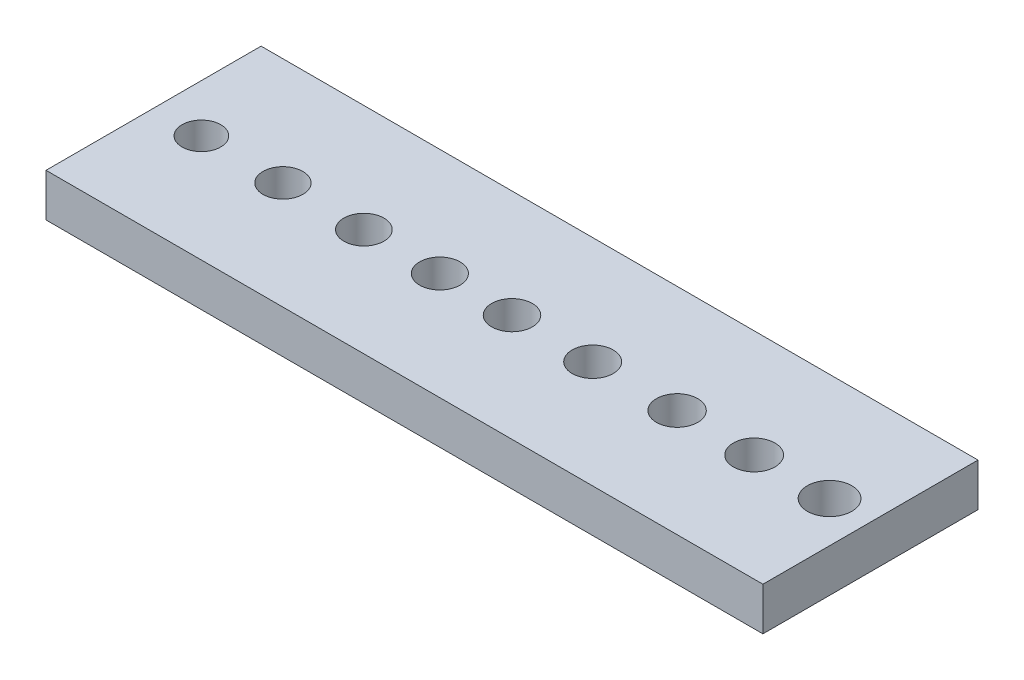
ISO-10303-21;
HEADER;
FILE_DESCRIPTION(('STEP AP214'),'2;1');
FILE_NAME('part.step','',(''),(''),'','','');
FILE_SCHEMA(('AUTOMOTIVE_DESIGN { 1 0 10303 214 1 1 1 1 }'));
ENDSEC;
DATA;
#1=APPLICATION_CONTEXT('core data for automotive mechanical design processes');
#2=APPLICATION_PROTOCOL_DEFINITION('international standard','automotive_design',2000,#1);
#3=PRODUCT_CONTEXT('',#1,'mechanical');
#4=PRODUCT('Part','Part','',(#3));
#5=PRODUCT_RELATED_PRODUCT_CATEGORY('part','',(#4));
#6=PRODUCT_DEFINITION_FORMATION('','',#4);
#7=PRODUCT_DEFINITION_CONTEXT('part definition',#1,'design');
#8=PRODUCT_DEFINITION('design','',#6,#7);
#9=PRODUCT_DEFINITION_SHAPE('','',#8);
#10=(LENGTH_UNIT() NAMED_UNIT(*) SI_UNIT(.MILLI.,.METRE.));
#11=(NAMED_UNIT(*) PLANE_ANGLE_UNIT() SI_UNIT($,.RADIAN.));
#12=(NAMED_UNIT(*) SI_UNIT($,.STERADIAN.) SOLID_ANGLE_UNIT());
#13=UNCERTAINTY_MEASURE_WITH_UNIT(LENGTH_MEASURE(1.E-05),#10,'distance_accuracy_value','');
#14=(GEOMETRIC_REPRESENTATION_CONTEXT(3) GLOBAL_UNCERTAINTY_ASSIGNED_CONTEXT((#13)) GLOBAL_UNIT_ASSIGNED_CONTEXT((#10,
#11,#12)) REPRESENTATION_CONTEXT('',''));
#15=CARTESIAN_POINT('',(0.,0.,0.));
#16=DIRECTION('',(0.,0.,1.));
#17=DIRECTION('',(1.,0.,0.));
#18=AXIS2_PLACEMENT_3D('',#15,#16,#17);
#19=CARTESIAN_POINT('',(0.,3.,0.));
#20=DIRECTION('',(0.,-1.,0.));
#21=DIRECTION('',(0.,0.,-1.));
#22=AXIS2_PLACEMENT_3D('',#19,#20,#21);
#23=PLANE('',#22);
#24=CARTESIAN_POINT('',(22.1489276135597,3.,0.));
#25=DIRECTION('',(0.,1.,0.));
#26=DIRECTION('',(0.,0.,1.));
#27=AXIS2_PLACEMENT_3D('',#24,#25,#26);
#28=CIRCLE('',#27,1.55);
#29=CARTESIAN_POINT('',(22.1489276135597,3.,1.55));
#30=VERTEX_POINT('',#29);
#31=EDGE_CURVE('E167',#30,#30,#28,.T.);
#32=ORIENTED_EDGE('',*,*,#31,.F.);
#33=EDGE_LOOP('',(#32));
#34=FACE_BOUND('',#33,.T.);
#35=DIRECTION('',(0.,0.,-1.));
#36=VECTOR('',#35,1.);
#37=CARTESIAN_POINT('',(25.,3.,7.50000000000001));
#38=LINE('',#37,#36);
#39=CARTESIAN_POINT('',(25.,3.,7.50000000000001));
#40=VERTEX_POINT('',#39);
#41=CARTESIAN_POINT('',(25.,3.,-7.49999999999999));
#42=VERTEX_POINT('',#41);
#43=EDGE_CURVE('E92',#40,#42,#38,.T.);
#44=ORIENTED_EDGE('',*,*,#43,.T.);
#45=DIRECTION('',(-1.,0.,0.));
#46=VECTOR('',#45,1.);
#47=CARTESIAN_POINT('',(-25.,3.,-7.50000000000001));
#48=LINE('',#47,#46);
#49=CARTESIAN_POINT('',(-25.,3.,-7.50000000000001));
#50=VERTEX_POINT('',#49);
#51=EDGE_CURVE('E87',#42,#50,#48,.T.);
#52=ORIENTED_EDGE('',*,*,#51,.T.);
#53=DIRECTION('',(0.,0.,1.));
#54=VECTOR('',#53,1.);
#55=CARTESIAN_POINT('',(-25.,3.,7.50000000000001));
#56=LINE('',#55,#54);
#57=CARTESIAN_POINT('',(-25.,3.,7.50000000000001));
#58=VERTEX_POINT('',#57);
#59=EDGE_CURVE('E90',#50,#58,#56,.T.);
#60=ORIENTED_EDGE('',*,*,#59,.T.);
#61=DIRECTION('',(1.,0.,0.));
#62=VECTOR('',#61,1.);
#63=CARTESIAN_POINT('',(-25.,3.,7.50000000000001));
#64=LINE('',#63,#62);
#65=EDGE_CURVE('E57',#58,#40,#64,.T.);
#66=ORIENTED_EDGE('',*,*,#65,.T.);
#67=EDGE_LOOP('',(#44,#52,#60,#66));
#68=FACE_BOUND('',#67,.T.);
#69=CARTESIAN_POINT('',(-21.6626681984285,3.,0.));
#70=DIRECTION('',(0.,1.,0.));
#71=DIRECTION('',(0.,0.,1.));
#72=AXIS2_PLACEMENT_3D('',#69,#70,#71);
#73=CIRCLE('',#72,1.35);
#74=CARTESIAN_POINT('',(-21.6626681984285,3.,1.35));
#75=VERTEX_POINT('',#74);
#76=EDGE_CURVE('E108',#75,#75,#73,.T.);
#77=ORIENTED_EDGE('',*,*,#76,.F.);
#78=EDGE_LOOP('',(#77));
#79=FACE_BOUND('',#78,.T.);
#80=CARTESIAN_POINT('',(-15.9774005820567,3.,0.));
#81=DIRECTION('',(0.,1.,0.));
#82=DIRECTION('',(0.,0.,1.));
#83=AXIS2_PLACEMENT_3D('',#80,#81,#82);
#84=CIRCLE('',#83,1.39);
#85=CARTESIAN_POINT('',(-15.9774005820567,3.,1.39));
#86=VERTEX_POINT('',#85);
#87=EDGE_CURVE('E123',#86,#86,#84,.T.);
#88=ORIENTED_EDGE('',*,*,#87,.F.);
#89=EDGE_LOOP('',(#88));
#90=FACE_BOUND('',#89,.T.);
#91=CARTESIAN_POINT('',(-10.3308082555922,3.,0.));
#92=DIRECTION('',(0.,1.,0.));
#93=DIRECTION('',(0.,0.,1.));
#94=AXIS2_PLACEMENT_3D('',#91,#92,#93);
#95=CIRCLE('',#94,1.4);
#96=CARTESIAN_POINT('',(-10.3308082555922,3.,1.4));
#97=VERTEX_POINT('',#96);
#98=EDGE_CURVE('E129',#97,#97,#95,.T.);
#99=ORIENTED_EDGE('',*,*,#98,.F.);
#100=EDGE_LOOP('',(#99));
#101=FACE_BOUND('',#100,.T.);
#102=CARTESIAN_POINT('',(-5.03229353829333,3.,0.));
#103=DIRECTION('',(0.,1.,0.));
#104=DIRECTION('',(0.,0.,1.));
#105=AXIS2_PLACEMENT_3D('',#102,#103,#104);
#106=CIRCLE('',#105,1.41);
#107=CARTESIAN_POINT('',(-5.03229353829333,3.,1.41));
#108=VERTEX_POINT('',#107);
#109=EDGE_CURVE('E135',#108,#108,#106,.T.);
#110=ORIENTED_EDGE('',*,*,#109,.F.);
#111=EDGE_LOOP('',(#110));
#112=FACE_BOUND('',#111,.T.);
#113=CARTESIAN_POINT('',(0.,3.,0.));
#114=DIRECTION('',(0.,1.,0.));
#115=DIRECTION('',(0.,0.,1.));
#116=AXIS2_PLACEMENT_3D('',#113,#114,#115);
#117=CIRCLE('',#116,1.42);
#118=CARTESIAN_POINT('',(0.,3.,1.42));
#119=VERTEX_POINT('',#118);
#120=EDGE_CURVE('E141',#119,#119,#117,.T.);
#121=ORIENTED_EDGE('',*,*,#120,.F.);
#122=EDGE_LOOP('',(#121));
#123=FACE_BOUND('',#122,.T.);
#124=CARTESIAN_POINT('',(5.62658879630789,3.,0.));
#125=DIRECTION('',(0.,1.,0.));
#126=DIRECTION('',(0.,0.,1.));
#127=AXIS2_PLACEMENT_3D('',#124,#125,#126);
#128=CIRCLE('',#127,1.43);
#129=CARTESIAN_POINT('',(5.62658879630789,3.,1.43));
#130=VERTEX_POINT('',#129);
#131=EDGE_CURVE('E147',#130,#130,#128,.T.);
#132=ORIENTED_EDGE('',*,*,#131,.F.);
#133=EDGE_LOOP('',(#132));
#134=FACE_BOUND('',#133,.T.);
#135=CARTESIAN_POINT('',(11.5163956606518,3.,0.));
#136=DIRECTION('',(0.,1.,0.));
#137=DIRECTION('',(0.,0.,1.));
#138=AXIS2_PLACEMENT_3D('',#135,#136,#137);
#139=CIRCLE('',#138,1.44);
#140=CARTESIAN_POINT('',(11.5163956606518,3.,1.44));
#141=VERTEX_POINT('',#140);
#142=EDGE_CURVE('E153',#141,#141,#139,.T.);
#143=ORIENTED_EDGE('',*,*,#142,.F.);
#144=EDGE_LOOP('',(#143));
#145=FACE_BOUND('',#144,.T.);
#146=CARTESIAN_POINT('',(16.8874494202306,3.,0.));
#147=DIRECTION('',(0.,1.,0.));
#148=DIRECTION('',(0.,0.,1.));
#149=AXIS2_PLACEMENT_3D('',#146,#147,#148);
#150=CIRCLE('',#149,1.45);
#151=CARTESIAN_POINT('',(16.8874494202306,3.,1.45));
#152=VERTEX_POINT('',#151);
#153=EDGE_CURVE('E159',#152,#152,#150,.T.);
#154=ORIENTED_EDGE('',*,*,#153,.F.);
#155=EDGE_LOOP('',(#154));
#156=FACE_BOUND('',#155,.T.);
#157=ADVANCED_FACE('F39',(#34,#68,#79,#90,#101,#112,#123,#134,#145,#156),#23,.F.);
#158=CARTESIAN_POINT('',(0.,0.,0.));
#159=DIRECTION('',(0.,-1.,0.));
#160=DIRECTION('',(0.,0.,-1.));
#161=AXIS2_PLACEMENT_3D('',#158,#159,#160);
#162=PLANE('',#161);
#163=CARTESIAN_POINT('',(22.1489276135597,0.,0.));
#164=DIRECTION('',(0.,-1.,0.));
#165=DIRECTION('',(0.,0.,-1.));
#166=AXIS2_PLACEMENT_3D('',#163,#164,#165);
#167=CIRCLE('',#166,1.55);
#168=CARTESIAN_POINT('',(22.1489276135597,0.,-1.55));
#169=VERTEX_POINT('',#168);
#170=EDGE_CURVE('E43',#169,#169,#167,.T.);
#171=ORIENTED_EDGE('',*,*,#170,.F.);
#172=EDGE_LOOP('',(#171));
#173=FACE_BOUND('',#172,.T.);
#174=CARTESIAN_POINT('',(11.5163956606518,0.,0.));
#175=DIRECTION('',(0.,1.,0.));
#176=DIRECTION('',(0.,0.,1.));
#177=AXIS2_PLACEMENT_3D('',#174,#175,#176);
#178=CIRCLE('',#177,1.44);
#179=CARTESIAN_POINT('',(11.5163956606518,0.,1.44));
#180=VERTEX_POINT('',#179);
#181=EDGE_CURVE('E156',#180,#180,#178,.T.);
#182=ORIENTED_EDGE('',*,*,#181,.T.);
#183=EDGE_LOOP('',(#182));
#184=FACE_BOUND('',#183,.T.);
#185=CARTESIAN_POINT('',(0.,0.,0.));
#186=DIRECTION('',(0.,1.,0.));
#187=DIRECTION('',(0.,0.,1.));
#188=AXIS2_PLACEMENT_3D('',#185,#186,#187);
#189=CIRCLE('',#188,1.42);
#190=CARTESIAN_POINT('',(0.,0.,1.42));
#191=VERTEX_POINT('',#190);
#192=EDGE_CURVE('E144',#191,#191,#189,.T.);
#193=ORIENTED_EDGE('',*,*,#192,.T.);
#194=EDGE_LOOP('',(#193));
#195=FACE_BOUND('',#194,.T.);
#196=CARTESIAN_POINT('',(-10.3308082555922,0.,0.));
#197=DIRECTION('',(0.,1.,0.));
#198=DIRECTION('',(0.,0.,1.));
#199=AXIS2_PLACEMENT_3D('',#196,#197,#198);
#200=CIRCLE('',#199,1.4);
#201=CARTESIAN_POINT('',(-10.3308082555922,0.,1.4));
#202=VERTEX_POINT('',#201);
#203=EDGE_CURVE('E132',#202,#202,#200,.T.);
#204=ORIENTED_EDGE('',*,*,#203,.T.);
#205=EDGE_LOOP('',(#204));
#206=FACE_BOUND('',#205,.T.);
#207=CARTESIAN_POINT('',(-21.6626681984285,0.,0.));
#208=DIRECTION('',(0.,1.,0.));
#209=DIRECTION('',(0.,0.,1.));
#210=AXIS2_PLACEMENT_3D('',#207,#208,#209);
#211=CIRCLE('',#210,1.35);
#212=CARTESIAN_POINT('',(-21.6626681984285,0.,1.35));
#213=VERTEX_POINT('',#212);
#214=EDGE_CURVE('E120',#213,#213,#211,.T.);
#215=ORIENTED_EDGE('',*,*,#214,.T.);
#216=EDGE_LOOP('',(#215));
#217=FACE_BOUND('',#216,.T.);
#218=DIRECTION('',(0.,0.,-1.));
#219=VECTOR('',#218,1.);
#220=CARTESIAN_POINT('',(25.,0.,7.50000000000001));
#221=LINE('',#220,#219);
#222=CARTESIAN_POINT('',(25.,0.,7.50000000000001));
#223=VERTEX_POINT('',#222);
#224=CARTESIAN_POINT('',(25.,0.,-7.49999999999999));
#225=VERTEX_POINT('',#224);
#226=EDGE_CURVE('E105',#223,#225,#221,.T.);
#227=ORIENTED_EDGE('',*,*,#226,.F.);
#228=DIRECTION('',(1.,0.,0.));
#229=VECTOR('',#228,1.);
#230=CARTESIAN_POINT('',(-25.,0.,7.50000000000001));
#231=LINE('',#230,#229);
#232=CARTESIAN_POINT('',(-25.,0.,7.50000000000001));
#233=VERTEX_POINT('',#232);
#234=EDGE_CURVE('E80',#233,#223,#231,.T.);
#235=ORIENTED_EDGE('',*,*,#234,.F.);
#236=DIRECTION('',(0.,0.,1.));
#237=VECTOR('',#236,1.);
#238=CARTESIAN_POINT('',(-25.,0.,7.50000000000001));
#239=LINE('',#238,#237);
#240=CARTESIAN_POINT('',(-25.,0.,-7.50000000000001));
#241=VERTEX_POINT('',#240);
#242=EDGE_CURVE('E74',#241,#233,#239,.T.);
#243=ORIENTED_EDGE('',*,*,#242,.F.);
#244=DIRECTION('',(-1.,0.,0.));
#245=VECTOR('',#244,1.);
#246=CARTESIAN_POINT('',(-25.,0.,-7.50000000000001));
#247=LINE('',#246,#245);
#248=EDGE_CURVE('E96',#225,#241,#247,.T.);
#249=ORIENTED_EDGE('',*,*,#248,.F.);
#250=EDGE_LOOP('',(#227,#235,#243,#249));
#251=FACE_BOUND('',#250,.T.);
#252=CARTESIAN_POINT('',(-15.9774005820567,0.,0.));
#253=DIRECTION('',(0.,1.,0.));
#254=DIRECTION('',(0.,0.,1.));
#255=AXIS2_PLACEMENT_3D('',#252,#253,#254);
#256=CIRCLE('',#255,1.39);
#257=CARTESIAN_POINT('',(-15.9774005820567,0.,1.39));
#258=VERTEX_POINT('',#257);
#259=EDGE_CURVE('E126',#258,#258,#256,.T.);
#260=ORIENTED_EDGE('',*,*,#259,.T.);
#261=EDGE_LOOP('',(#260));
#262=FACE_BOUND('',#261,.T.);
#263=CARTESIAN_POINT('',(-5.03229353829333,0.,0.));
#264=DIRECTION('',(0.,1.,0.));
#265=DIRECTION('',(0.,0.,1.));
#266=AXIS2_PLACEMENT_3D('',#263,#264,#265);
#267=CIRCLE('',#266,1.41);
#268=CARTESIAN_POINT('',(-5.03229353829333,0.,1.41));
#269=VERTEX_POINT('',#268);
#270=EDGE_CURVE('E138',#269,#269,#267,.T.);
#271=ORIENTED_EDGE('',*,*,#270,.T.);
#272=EDGE_LOOP('',(#271));
#273=FACE_BOUND('',#272,.T.);
#274=CARTESIAN_POINT('',(5.62658879630789,0.,0.));
#275=DIRECTION('',(0.,1.,0.));
#276=DIRECTION('',(0.,0.,1.));
#277=AXIS2_PLACEMENT_3D('',#274,#275,#276);
#278=CIRCLE('',#277,1.43);
#279=CARTESIAN_POINT('',(5.62658879630789,0.,1.43));
#280=VERTEX_POINT('',#279);
#281=EDGE_CURVE('E150',#280,#280,#278,.T.);
#282=ORIENTED_EDGE('',*,*,#281,.T.);
#283=EDGE_LOOP('',(#282));
#284=FACE_BOUND('',#283,.T.);
#285=CARTESIAN_POINT('',(16.8874494202306,0.,0.));
#286=DIRECTION('',(0.,1.,0.));
#287=DIRECTION('',(0.,0.,1.));
#288=AXIS2_PLACEMENT_3D('',#285,#286,#287);
#289=CIRCLE('',#288,1.45);
#290=CARTESIAN_POINT('',(16.8874494202306,0.,1.45));
#291=VERTEX_POINT('',#290);
#292=EDGE_CURVE('E162',#291,#291,#289,.T.);
#293=ORIENTED_EDGE('',*,*,#292,.T.);
#294=EDGE_LOOP('',(#293));
#295=FACE_BOUND('',#294,.T.);
#296=ADVANCED_FACE('F116',(#173,#184,#195,#206,#217,#251,#262,#273,#284,#295),#162,.T.);
#297=CARTESIAN_POINT('',(25.,3.,7.50000000000001));
#298=DIRECTION('',(-1.,0.,0.));
#299=DIRECTION('',(0.,0.,1.));
#300=AXIS2_PLACEMENT_3D('',#297,#298,#299);
#301=PLANE('',#300);
#302=ORIENTED_EDGE('',*,*,#226,.T.);
#303=DIRECTION('',(0.,-1.,0.));
#304=VECTOR('',#303,1.);
#305=CARTESIAN_POINT('',(25.,3.,-7.49999999999999));
#306=LINE('',#305,#304);
#307=EDGE_CURVE('E11',#42,#225,#306,.T.);
#308=ORIENTED_EDGE('',*,*,#307,.F.);
#309=ORIENTED_EDGE('',*,*,#43,.F.);
#310=DIRECTION('',(0.,-1.,0.));
#311=VECTOR('',#310,1.);
#312=CARTESIAN_POINT('',(25.,3.,7.50000000000001));
#313=LINE('',#312,#311);
#314=EDGE_CURVE('E101',#40,#223,#313,.T.);
#315=ORIENTED_EDGE('',*,*,#314,.T.);
#316=EDGE_LOOP('',(#302,#308,#309,#315));
#317=FACE_BOUND('',#316,.T.);
#318=ADVANCED_FACE('F41',(#317),#301,.F.);
#319=CARTESIAN_POINT('',(-25.,3.,-7.50000000000001));
#320=DIRECTION('',(0.,0.,1.));
#321=DIRECTION('',(1.,0.,0.));
#322=AXIS2_PLACEMENT_3D('',#319,#320,#321);
#323=PLANE('',#322);
#324=ORIENTED_EDGE('',*,*,#248,.T.);
#325=DIRECTION('',(0.,-1.,0.));
#326=VECTOR('',#325,1.);
#327=CARTESIAN_POINT('',(-25.,3.,-7.50000000000001));
#328=LINE('',#327,#326);
#329=EDGE_CURVE('E49',#50,#241,#328,.T.);
#330=ORIENTED_EDGE('',*,*,#329,.F.);
#331=ORIENTED_EDGE('',*,*,#51,.F.);
#332=ORIENTED_EDGE('',*,*,#307,.T.);
#333=EDGE_LOOP('',(#324,#330,#331,#332));
#334=FACE_BOUND('',#333,.T.);
#335=ADVANCED_FACE('F95',(#334),#323,.F.);
#336=CARTESIAN_POINT('',(-25.,3.,7.50000000000001));
#337=DIRECTION('',(1.,0.,0.));
#338=DIRECTION('',(0.,0.,-1.));
#339=AXIS2_PLACEMENT_3D('',#336,#337,#338);
#340=PLANE('',#339);
#341=ORIENTED_EDGE('',*,*,#242,.T.);
#342=DIRECTION('',(0.,-1.,0.));
#343=VECTOR('',#342,1.);
#344=CARTESIAN_POINT('',(-25.,3.,7.50000000000001));
#345=LINE('',#344,#343);
#346=EDGE_CURVE('E97',#58,#233,#345,.T.);
#347=ORIENTED_EDGE('',*,*,#346,.F.);
#348=ORIENTED_EDGE('',*,*,#59,.F.);
#349=ORIENTED_EDGE('',*,*,#329,.T.);
#350=EDGE_LOOP('',(#341,#347,#348,#349));
#351=FACE_BOUND('',#350,.T.);
#352=ADVANCED_FACE('F99',(#351),#340,.F.);
#353=CARTESIAN_POINT('',(-25.,3.,7.50000000000001));
#354=DIRECTION('',(0.,0.,-1.));
#355=DIRECTION('',(-1.,0.,0.));
#356=AXIS2_PLACEMENT_3D('',#353,#354,#355);
#357=PLANE('',#356);
#358=ORIENTED_EDGE('',*,*,#234,.T.);
#359=ORIENTED_EDGE('',*,*,#314,.F.);
#360=ORIENTED_EDGE('',*,*,#65,.F.);
#361=ORIENTED_EDGE('',*,*,#346,.T.);
#362=EDGE_LOOP('',(#358,#359,#360,#361));
#363=FACE_BOUND('',#362,.T.);
#364=ADVANCED_FACE('F113',(#363),#357,.F.);
#365=CARTESIAN_POINT('',(-21.6626681984285,3.,0.));
#366=DIRECTION('',(0.,-1.,0.));
#367=DIRECTION('',(0.,0.,-1.));
#368=AXIS2_PLACEMENT_3D('',#365,#366,#367);
#369=CYLINDRICAL_SURFACE('',#368,1.35);
#370=ORIENTED_EDGE('',*,*,#76,.T.);
#371=EDGE_LOOP('',(#370));
#372=FACE_BOUND('',#371,.T.);
#373=ORIENTED_EDGE('',*,*,#214,.F.);
#374=EDGE_LOOP('',(#373));
#375=FACE_BOUND('',#374,.T.);
#376=ADVANCED_FACE('F187',(#372,#375),#369,.F.);
#377=CARTESIAN_POINT('',(-15.9774005820567,3.,0.));
#378=DIRECTION('',(0.,-1.,0.));
#379=DIRECTION('',(0.,0.,-1.));
#380=AXIS2_PLACEMENT_3D('',#377,#378,#379);
#381=CYLINDRICAL_SURFACE('',#380,1.39);
#382=ORIENTED_EDGE('',*,*,#87,.T.);
#383=EDGE_LOOP('',(#382));
#384=FACE_BOUND('',#383,.T.);
#385=ORIENTED_EDGE('',*,*,#259,.F.);
#386=EDGE_LOOP('',(#385));
#387=FACE_BOUND('',#386,.T.);
#388=ADVANCED_FACE('F189',(#384,#387),#381,.F.);
#389=CARTESIAN_POINT('',(-10.3308082555922,3.,0.));
#390=DIRECTION('',(0.,-1.,0.));
#391=DIRECTION('',(0.,0.,-1.));
#392=AXIS2_PLACEMENT_3D('',#389,#390,#391);
#393=CYLINDRICAL_SURFACE('',#392,1.4);
#394=ORIENTED_EDGE('',*,*,#98,.T.);
#395=EDGE_LOOP('',(#394));
#396=FACE_BOUND('',#395,.T.);
#397=ORIENTED_EDGE('',*,*,#203,.F.);
#398=EDGE_LOOP('',(#397));
#399=FACE_BOUND('',#398,.T.);
#400=ADVANCED_FACE('F196',(#396,#399),#393,.F.);
#401=CARTESIAN_POINT('',(-5.03229353829333,3.,0.));
#402=DIRECTION('',(0.,-1.,0.));
#403=DIRECTION('',(0.,0.,-1.));
#404=AXIS2_PLACEMENT_3D('',#401,#402,#403);
#405=CYLINDRICAL_SURFACE('',#404,1.41);
#406=ORIENTED_EDGE('',*,*,#109,.T.);
#407=EDGE_LOOP('',(#406));
#408=FACE_BOUND('',#407,.T.);
#409=ORIENTED_EDGE('',*,*,#270,.F.);
#410=EDGE_LOOP('',(#409));
#411=FACE_BOUND('',#410,.T.);
#412=ADVANCED_FACE('F264',(#408,#411),#405,.F.);
#413=CARTESIAN_POINT('',(0.,3.,0.));
#414=DIRECTION('',(0.,-1.,0.));
#415=DIRECTION('',(0.,0.,-1.));
#416=AXIS2_PLACEMENT_3D('',#413,#414,#415);
#417=CYLINDRICAL_SURFACE('',#416,1.42);
#418=ORIENTED_EDGE('',*,*,#120,.T.);
#419=EDGE_LOOP('',(#418));
#420=FACE_BOUND('',#419,.T.);
#421=ORIENTED_EDGE('',*,*,#192,.F.);
#422=EDGE_LOOP('',(#421));
#423=FACE_BOUND('',#422,.T.);
#424=ADVANCED_FACE('F254',(#420,#423),#417,.F.);
#425=CARTESIAN_POINT('',(5.62658879630789,3.,0.));
#426=DIRECTION('',(0.,-1.,0.));
#427=DIRECTION('',(0.,0.,-1.));
#428=AXIS2_PLACEMENT_3D('',#425,#426,#427);
#429=CYLINDRICAL_SURFACE('',#428,1.43);
#430=ORIENTED_EDGE('',*,*,#131,.T.);
#431=EDGE_LOOP('',(#430));
#432=FACE_BOUND('',#431,.T.);
#433=ORIENTED_EDGE('',*,*,#281,.F.);
#434=EDGE_LOOP('',(#433));
#435=FACE_BOUND('',#434,.T.);
#436=ADVANCED_FACE('F244',(#432,#435),#429,.F.);
#437=CARTESIAN_POINT('',(11.5163956606518,3.,0.));
#438=DIRECTION('',(0.,-1.,0.));
#439=DIRECTION('',(0.,0.,-1.));
#440=AXIS2_PLACEMENT_3D('',#437,#438,#439);
#441=CYLINDRICAL_SURFACE('',#440,1.44);
#442=ORIENTED_EDGE('',*,*,#142,.T.);
#443=EDGE_LOOP('',(#442));
#444=FACE_BOUND('',#443,.T.);
#445=ORIENTED_EDGE('',*,*,#181,.F.);
#446=EDGE_LOOP('',(#445));
#447=FACE_BOUND('',#446,.T.);
#448=ADVANCED_FACE('F232',(#444,#447),#441,.F.);
#449=CARTESIAN_POINT('',(16.8874494202306,3.,0.));
#450=DIRECTION('',(0.,-1.,0.));
#451=DIRECTION('',(0.,0.,-1.));
#452=AXIS2_PLACEMENT_3D('',#449,#450,#451);
#453=CYLINDRICAL_SURFACE('',#452,1.45);
#454=ORIENTED_EDGE('',*,*,#153,.T.);
#455=EDGE_LOOP('',(#454));
#456=FACE_BOUND('',#455,.T.);
#457=ORIENTED_EDGE('',*,*,#292,.F.);
#458=EDGE_LOOP('',(#457));
#459=FACE_BOUND('',#458,.T.);
#460=ADVANCED_FACE('F226',(#456,#459),#453,.F.);
#461=CARTESIAN_POINT('',(22.1489276135597,3.,0.));
#462=DIRECTION('',(0.,1.,0.));
#463=DIRECTION('',(0.,0.,1.));
#464=AXIS2_PLACEMENT_3D('',#461,#462,#463);
#465=CYLINDRICAL_SURFACE('',#464,1.55);
#466=ORIENTED_EDGE('',*,*,#170,.T.);
#467=EDGE_LOOP('',(#466));
#468=FACE_BOUND('',#467,.T.);
#469=ORIENTED_EDGE('',*,*,#31,.T.);
#470=EDGE_LOOP('',(#469));
#471=FACE_BOUND('',#470,.T.);
#472=ADVANCED_FACE('F174',(#468,#471),#465,.F.);
#473=CLOSED_SHELL('',(#157,#296,#318,#335,#352,#364,#376,#388,#400,#412,#424,#436,#448,#460,#472));
#474=MANIFOLD_SOLID_BREP('B2',#473);
#475=ADVANCED_BREP_SHAPE_REPRESENTATION('',(#18,#474),#14);
#476=SHAPE_DEFINITION_REPRESENTATION(#9,#475);
ENDSEC;
END-ISO-10303-21;
